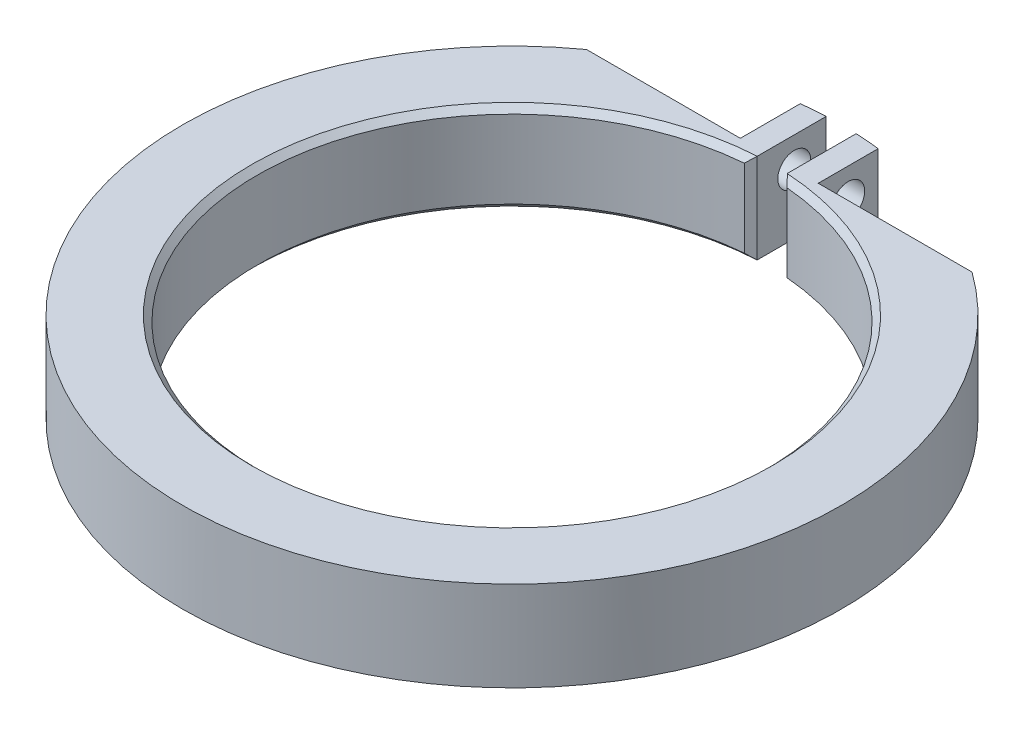
ISO-10303-21;
HEADER;
FILE_DESCRIPTION(('STEP AP214'),'2;1');
FILE_NAME('part.step','',(''),(''),'','','');
FILE_SCHEMA(('AUTOMOTIVE_DESIGN { 1 0 10303 214 1 1 1 1 }'));
ENDSEC;
DATA;
#1=APPLICATION_CONTEXT('core data for automotive mechanical design processes');
#2=APPLICATION_PROTOCOL_DEFINITION('international standard','automotive_design',2000,#1);
#3=PRODUCT_CONTEXT('',#1,'mechanical');
#4=PRODUCT('Part','Part','',(#3));
#5=PRODUCT_RELATED_PRODUCT_CATEGORY('part','',(#4));
#6=PRODUCT_DEFINITION_FORMATION('','',#4);
#7=PRODUCT_DEFINITION_CONTEXT('part definition',#1,'design');
#8=PRODUCT_DEFINITION('design','',#6,#7);
#9=PRODUCT_DEFINITION_SHAPE('','',#8);
#10=(LENGTH_UNIT() NAMED_UNIT(*) SI_UNIT(.MILLI.,.METRE.));
#11=(NAMED_UNIT(*) PLANE_ANGLE_UNIT() SI_UNIT($,.RADIAN.));
#12=(NAMED_UNIT(*) SI_UNIT($,.STERADIAN.) SOLID_ANGLE_UNIT());
#13=UNCERTAINTY_MEASURE_WITH_UNIT(LENGTH_MEASURE(1.E-05),#10,'distance_accuracy_value','');
#14=(GEOMETRIC_REPRESENTATION_CONTEXT(3) GLOBAL_UNCERTAINTY_ASSIGNED_CONTEXT((#13)) GLOBAL_UNIT_ASSIGNED_CONTEXT((#10,
#11,#12)) REPRESENTATION_CONTEXT('',''));
#15=CARTESIAN_POINT('',(0.,0.,0.));
#16=DIRECTION('',(0.,0.,1.));
#17=DIRECTION('',(1.,0.,0.));
#18=AXIS2_PLACEMENT_3D('',#15,#16,#17);
#19=CARTESIAN_POINT('',(0.,15.,0.));
#20=DIRECTION('',(0.,1.,0.));
#21=DIRECTION('',(0.,0.,1.));
#22=AXIS2_PLACEMENT_3D('',#19,#20,#21);
#23=PLANE('',#22);
#24=DIRECTION('',(0.,0.,-1.));
#25=VECTOR('',#24,1.);
#26=CARTESIAN_POINT('',(2.5,15.,-42.4264068711929));
#27=LINE('',#26,#25);
#28=CARTESIAN_POINT('',(2.5,15.,-43.4908652918344));
#29=VERTEX_POINT('',#28);
#30=CARTESIAN_POINT('',(2.50000000000001,15.,-54.9431524395898));
#31=VERTEX_POINT('',#30);
#32=EDGE_CURVE('E325',#29,#31,#27,.T.);
#33=ORIENTED_EDGE('',*,*,#32,.F.);
#34=DIRECTION('',(0.664287836400795,0.,0.747476869481558));
#35=VECTOR('',#34,1.);
#36=CARTESIAN_POINT('',(22.9917493987869,15.,-20.4329258693754));
#37=LINE('',#36,#35);
#38=CARTESIAN_POINT('',(2.55882352941177,15.,-43.4246752681621));
#39=VERTEX_POINT('',#38);
#40=EDGE_CURVE('E11',#29,#39,#37,.T.);
#41=ORIENTED_EDGE('',*,*,#40,.T.);
#42=CARTESIAN_POINT('',(0.,15.,0.));
#43=DIRECTION('',(0.,1.,0.));
#44=DIRECTION('',(0.,0.,1.));
#45=AXIS2_PLACEMENT_3D('',#42,#43,#44);
#46=CIRCLE('',#45,43.5);
#47=CARTESIAN_POINT('',(-2.5,15.,-43.4281015012169));
#48=VERTEX_POINT('',#47);
#49=EDGE_CURVE('E50',#39,#48,#46,.F.);
#50=ORIENTED_EDGE('',*,*,#49,.T.);
#51=DIRECTION('',(0.,0.,1.));
#52=VECTOR('',#51,1.);
#53=CARTESIAN_POINT('',(-2.5,15.,-42.4264068711929));
#54=LINE('',#53,#52);
#55=CARTESIAN_POINT('',(-2.5,15.,-54.9431524395898));
#56=VERTEX_POINT('',#55);
#57=EDGE_CURVE('E317',#56,#48,#54,.T.);
#58=ORIENTED_EDGE('',*,*,#57,.F.);
#59=CARTESIAN_POINT('',(0.,15.,0.));
#60=DIRECTION('',(0.,1.,0.));
#61=DIRECTION('',(0.,0.,1.));
#62=AXIS2_PLACEMENT_3D('',#59,#60,#61);
#63=CIRCLE('',#62,55.);
#64=CARTESIAN_POINT('',(-6.5,15.,-54.6145584986275));
#65=VERTEX_POINT('',#64);
#66=EDGE_CURVE('E180',#56,#65,#63,.T.);
#67=ORIENTED_EDGE('',*,*,#66,.T.);
#68=DIRECTION('',(0.,0.,-1.));
#69=VECTOR('',#68,1.);
#70=CARTESIAN_POINT('',(-6.5,15.,-54.6145584986275));
#71=LINE('',#70,#69);
#72=CARTESIAN_POINT('',(-6.5,15.,-44.6145584986275));
#73=VERTEX_POINT('',#72);
#74=EDGE_CURVE('E173',#73,#65,#71,.T.);
#75=ORIENTED_EDGE('',*,*,#74,.F.);
#76=DIRECTION('',(1.,0.,0.));
#77=VECTOR('',#76,1.);
#78=CARTESIAN_POINT('',(-6.5,15.,-44.6145584986275));
#79=LINE('',#78,#77);
#80=CARTESIAN_POINT('',(-32.1642840736826,15.,-44.6145584986274));
#81=VERTEX_POINT('',#80);
#82=EDGE_CURVE('E159',#81,#73,#79,.T.);
#83=ORIENTED_EDGE('',*,*,#82,.F.);
#84=CARTESIAN_POINT('',(32.1642840736826,15.,-44.6145584986274));
#85=VERTEX_POINT('',#84);
#86=EDGE_CURVE('E171',#81,#85,#63,.T.);
#87=ORIENTED_EDGE('',*,*,#86,.T.);
#88=DIRECTION('',(1.,0.,0.));
#89=VECTOR('',#88,1.);
#90=CARTESIAN_POINT('',(6.5,15.,-44.6145584986275));
#91=LINE('',#90,#89);
#92=CARTESIAN_POINT('',(6.5,15.,-44.6145584986275));
#93=VERTEX_POINT('',#92);
#94=EDGE_CURVE('E352',#93,#85,#91,.T.);
#95=ORIENTED_EDGE('',*,*,#94,.F.);
#96=DIRECTION('',(0.,0.,1.));
#97=VECTOR('',#96,1.);
#98=CARTESIAN_POINT('',(6.5,15.,-54.6145584986275));
#99=LINE('',#98,#97);
#100=CARTESIAN_POINT('',(6.5,15.,-54.6145584986275));
#101=VERTEX_POINT('',#100);
#102=EDGE_CURVE('E368',#101,#93,#99,.T.);
#103=ORIENTED_EDGE('',*,*,#102,.F.);
#104=EDGE_CURVE('E181',#101,#31,#63,.T.);
#105=ORIENTED_EDGE('',*,*,#104,.T.);
#106=EDGE_LOOP('',(#33,#41,#50,#58,#67,#75,#83,#87,#95,#103,#105));
#107=FACE_BOUND('',#106,.T.);
#108=ADVANCED_FACE('F35',(#107),#23,.T.);
#109=CARTESIAN_POINT('',(0.,0.,0.));
#110=DIRECTION('',(0.,1.,0.));
#111=DIRECTION('',(0.,0.,1.));
#112=AXIS2_PLACEMENT_3D('',#109,#110,#111);
#113=PLANE('',#112);
#114=DIRECTION('',(0.,0.,1.));
#115=VECTOR('',#114,1.);
#116=CARTESIAN_POINT('',(-2.5,0.,-42.4264068711929));
#117=LINE('',#116,#115);
#118=CARTESIAN_POINT('',(-2.5,0.,-54.9431524395898));
#119=VERTEX_POINT('',#118);
#120=CARTESIAN_POINT('',(-2.5,0.,-43.4281015012169));
#121=VERTEX_POINT('',#120);
#122=EDGE_CURVE('E374',#119,#121,#117,.T.);
#123=ORIENTED_EDGE('',*,*,#122,.T.);
#124=CARTESIAN_POINT('',(0.,0.,0.));
#125=DIRECTION('',(0.,1.,0.));
#126=DIRECTION('',(0.,0.,1.));
#127=AXIS2_PLACEMENT_3D('',#124,#125,#126);
#128=CIRCLE('',#127,43.5);
#129=CARTESIAN_POINT('',(2.55882352941179,0.,-43.4246752681621));
#130=VERTEX_POINT('',#129);
#131=EDGE_CURVE('E341',#121,#130,#128,.T.);
#132=ORIENTED_EDGE('',*,*,#131,.T.);
#133=DIRECTION('',(-0.664287836400795,0.,-0.747476869481558));
#134=VECTOR('',#133,1.);
#135=CARTESIAN_POINT('',(2.5,0.,-43.4908652918344));
#136=LINE('',#135,#134);
#137=CARTESIAN_POINT('',(2.5,0.,-43.4908652918344));
#138=VERTEX_POINT('',#137);
#139=EDGE_CURVE('E343',#130,#138,#136,.T.);
#140=ORIENTED_EDGE('',*,*,#139,.T.);
#141=DIRECTION('',(0.,0.,-1.));
#142=VECTOR('',#141,1.);
#143=CARTESIAN_POINT('',(2.5,0.,-42.4264068711929));
#144=LINE('',#143,#142);
#145=CARTESIAN_POINT('',(2.50000000000001,0.,-54.9431524395898));
#146=VERTEX_POINT('',#145);
#147=EDGE_CURVE('E324',#138,#146,#144,.T.);
#148=ORIENTED_EDGE('',*,*,#147,.T.);
#149=CARTESIAN_POINT('',(0.,0.,0.));
#150=DIRECTION('',(0.,1.,0.));
#151=DIRECTION('',(0.,0.,1.));
#152=AXIS2_PLACEMENT_3D('',#149,#150,#151);
#153=CIRCLE('',#152,55.);
#154=EDGE_CURVE('E185',#119,#146,#153,.T.);
#155=ORIENTED_EDGE('',*,*,#154,.F.);
#156=EDGE_LOOP('',(#123,#132,#140,#148,#155));
#157=FACE_BOUND('',#156,.T.);
#158=ADVANCED_FACE('F276',(#157),#113,.F.);
#159=CARTESIAN_POINT('',(0.,15.,0.));
#160=DIRECTION('',(0.,-1.,0.));
#161=DIRECTION('',(0.,0.,-1.));
#162=AXIS2_PLACEMENT_3D('',#159,#160,#161);
#163=CYLINDRICAL_SURFACE('',#162,55.);
#164=CARTESIAN_POINT('',(0.,5.,0.));
#165=DIRECTION('',(0.,1.,0.));
#166=DIRECTION('',(0.,0.,1.));
#167=AXIS2_PLACEMENT_3D('',#164,#165,#166);
#168=CIRCLE('',#167,55.);
#169=CARTESIAN_POINT('',(-6.5,5.,-54.6145584986275));
#170=VERTEX_POINT('',#169);
#171=CARTESIAN_POINT('',(-29.1904596739764,5.,-46.6145584986274));
#172=VERTEX_POINT('',#171);
#173=EDGE_CURVE('E400',#170,#172,#168,.T.);
#174=ORIENTED_EDGE('',*,*,#173,.F.);
#175=DIRECTION('',(0.,1.,0.));
#176=VECTOR('',#175,1.);
#177=CARTESIAN_POINT('',(-6.5,5.,-54.6145584986275));
#178=LINE('',#177,#176);
#179=EDGE_CURVE('E377',#170,#65,#178,.T.);
#180=ORIENTED_EDGE('',*,*,#179,.T.);
#181=ORIENTED_EDGE('',*,*,#66,.F.);
#182=DIRECTION('',(0.,1.,0.));
#183=VECTOR('',#182,1.);
#184=CARTESIAN_POINT('',(-2.5,0.,-54.9431524395898));
#185=LINE('',#184,#183);
#186=EDGE_CURVE('E192',#119,#56,#185,.T.);
#187=ORIENTED_EDGE('',*,*,#186,.F.);
#188=ORIENTED_EDGE('',*,*,#154,.T.);
#189=DIRECTION('',(0.,1.,0.));
#190=VECTOR('',#189,1.);
#191=CARTESIAN_POINT('',(2.50000000000001,0.,-54.9431524395898));
#192=LINE('',#191,#190);
#193=EDGE_CURVE('E188',#146,#31,#192,.T.);
#194=ORIENTED_EDGE('',*,*,#193,.T.);
#195=ORIENTED_EDGE('',*,*,#104,.F.);
#196=DIRECTION('',(0.,1.,0.));
#197=VECTOR('',#196,1.);
#198=CARTESIAN_POINT('',(6.5,5.,-54.6145584986275));
#199=LINE('',#198,#197);
#200=CARTESIAN_POINT('',(6.5,5.,-54.6145584986275));
#201=VERTEX_POINT('',#200);
#202=EDGE_CURVE('E363',#201,#101,#199,.T.);
#203=ORIENTED_EDGE('',*,*,#202,.F.);
#204=CARTESIAN_POINT('',(0.,5.,0.));
#205=DIRECTION('',(0.,1.,0.));
#206=DIRECTION('',(0.,0.,-1.));
#207=AXIS2_PLACEMENT_3D('',#204,#205,#206);
#208=CIRCLE('',#207,55.);
#209=CARTESIAN_POINT('',(29.1904596739764,5.,-46.6145584986274));
#210=VERTEX_POINT('',#209);
#211=EDGE_CURVE('E347',#210,#201,#208,.T.);
#212=ORIENTED_EDGE('',*,*,#211,.F.);
#213=CARTESIAN_POINT('',(29.1904596739764,5.,-46.6145584986274));
#214=CARTESIAN_POINT('',(29.2618950582999,5.00000410830266,-46.5698251893079));
#215=CARTESIAN_POINT('',(29.3332214542748,5.00150048570252,-46.5249310861389));
#216=CARTESIAN_POINT('',(29.4755868914035,5.0075763970651,-46.4348670040117));
#217=CARTESIAN_POINT('',(29.5466258737238,5.01215653303706,-46.3896969728934));
#218=CARTESIAN_POINT('',(29.7597310130058,5.03071895077998,-46.2535066736511));
#219=CARTESIAN_POINT('',(29.9012139733787,5.04952488058544,-46.1621640296161));
#220=CARTESIAN_POINT('',(30.182670971722,5.10137602829001,-45.9786345991746));
#221=CARTESIAN_POINT('',(30.3226236335103,5.13453487780392,-45.8864469467475));
#222=CARTESIAN_POINT('',(30.5982104292876,5.21691294581438,-45.7031374911376));
#223=CARTESIAN_POINT('',(30.7338526875045,5.26609970842943,-45.6120139163039));
#224=CARTESIAN_POINT('',(30.9136296618075,5.34558281005282,-45.4901176550028));
#225=CARTESIAN_POINT('',(30.9606118537982,5.36773726369652,-45.4581531074483));
#226=CARTESIAN_POINT('',(31.0535962187872,5.41460931547153,-45.3946839265736));
#227=CARTESIAN_POINT('',(31.0995984037196,5.43932688236891,-45.3631792876545));
#228=CARTESIAN_POINT('',(31.2358324010681,5.51755206138873,-45.2695800291169));
#229=CARTESIAN_POINT('',(31.3243712222158,5.57516652162368,-45.2083460759812));
#230=CARTESIAN_POINT('',(31.4956258256684,5.70344966090385,-45.0892063366155));
#231=CARTESIAN_POINT('',(31.5782840147289,5.77422792917874,-45.0313342782552));
#232=CARTESIAN_POINT('',(31.7336467298936,5.93031105628469,-44.9219837573017));
#233=CARTESIAN_POINT('',(31.8063702734681,6.01558743878918,-44.8704930971201));
#234=CARTESIAN_POINT('',(31.9143565542687,6.16983570890459,-44.7937120687995));
#235=CARTESIAN_POINT('',(31.9539029113345,6.23433491007644,-44.765499859494));
#236=CARTESIAN_POINT('',(32.0245392338627,6.37001782794382,-44.7149948904175));
#237=CARTESIAN_POINT('',(32.0556364037224,6.44119577972369,-44.6926970879768));
#238=CARTESIAN_POINT('',(32.1035804569386,6.5789853609633,-44.6582677032646));
#239=CARTESIAN_POINT('',(32.1218028956664,6.64486834930053,-44.6451569510118));
#240=CARTESIAN_POINT('',(32.1489536197877,6.7794006321575,-44.6256101405288));
#241=CARTESIAN_POINT('',(32.1579050349218,6.84804259636878,-44.6191574715829));
#242=CARTESIAN_POINT('',(32.163494337862,6.94466530757117,-44.6151276772019));
#243=CARTESIAN_POINT('',(32.1642975804329,6.97233836171307,-44.6145483681533));
#244=CARTESIAN_POINT('',(32.1642840736826,7.,-44.6145584986274));
#245=B_SPLINE_CURVE_WITH_KNOTS('',3,(#213,#214,#215,#216,#217,#218,#219,#220,#221,#222,#223,
#224,#225,#226,#227,#228,#229,#230,#231,#232,#233,#234,#235,#236,#237,#238,#239,#240,#241,#242,
#243,#244),.UNSPECIFIED.,.F.,.F.,(4,2,2,2,2,2,2,2,2,2,2,2,2,2,2,4),(0.,0.25282771647522,
0.505704804121882,1.01347651754073,1.52534395540327,2.03618125719,2.21910112323622,
2.40201876049517,2.76754890573759,3.13627064080194,3.5042763492189,3.74577355016985,
3.98706418200524,4.19500426291173,4.40242430726866,4.48542557306862),.UNSPECIFIED.);
#246=CARTESIAN_POINT('',(32.1642840736826,7.,-44.6145584986274));
#247=VERTEX_POINT('',#246);
#248=EDGE_CURVE('E213',#210,#247,#245,.T.);
#249=ORIENTED_EDGE('',*,*,#248,.T.);
#250=DIRECTION('',(0.,1.,0.));
#251=VECTOR('',#250,1.);
#252=CARTESIAN_POINT('',(32.1642840736826,5.,-44.6145584986274));
#253=LINE('',#252,#251);
#254=EDGE_CURVE('E174',#247,#85,#253,.T.);
#255=ORIENTED_EDGE('',*,*,#254,.T.);
#256=ORIENTED_EDGE('',*,*,#86,.F.);
#257=DIRECTION('',(0.,1.,0.));
#258=VECTOR('',#257,1.);
#259=CARTESIAN_POINT('',(-32.1642840736826,5.,-44.6145584986274));
#260=LINE('',#259,#258);
#261=CARTESIAN_POINT('',(-32.1642840736826,7.,-44.6145584986274));
#262=VERTEX_POINT('',#261);
#263=EDGE_CURVE('E155',#262,#81,#260,.T.);
#264=ORIENTED_EDGE('',*,*,#263,.F.);
#265=CARTESIAN_POINT('',(-32.1642840736826,7.,-44.6145584986274));
#266=CARTESIAN_POINT('',(-32.1643007930241,6.95962654996886,-44.6145458588829));
#267=CARTESIAN_POINT('',(-32.1625889999668,6.91926554770767,-44.6157805302863));
#268=CARTESIAN_POINT('',(-32.1558383664156,6.83901869520496,-44.6206464551745));
#269=CARTESIAN_POINT('',(-32.1508037826462,6.79913230342107,-44.6242746423976));
#270=CARTESIAN_POINT('',(-32.1376164344037,6.7206527281823,-44.6337727601258));
#271=CARTESIAN_POINT('',(-32.1295017608624,6.68204977529407,-44.6396153047959));
#272=CARTESIAN_POINT('',(-32.1103702607454,6.6059539996012,-44.6533790601372));
#273=CARTESIAN_POINT('',(-32.0993527118299,6.56846145569297,-44.6613007881821));
#274=CARTESIAN_POINT('',(-32.0624414049865,6.45841174838379,-44.6878144789277));
#275=CARTESIAN_POINT('',(-32.0326055683359,6.38781396457675,-44.7092152345839));
#276=CARTESIAN_POINT('',(-31.9644894091069,6.25290586522998,-44.7579398251131));
#277=CARTESIAN_POINT('',(-31.9261815324406,6.18861707713267,-44.7852829816436));
#278=CARTESIAN_POINT('',(-31.8203085100542,6.0332174427758,-44.8606078665391));
#279=CARTESIAN_POINT('',(-31.7482128027911,5.94670884784141,-44.9116894360233));
#280=CARTESIAN_POINT('',(-31.5937875931604,5.78834388503713,-45.0204571304663));
#281=CARTESIAN_POINT('',(-31.5114378583423,5.71651724795518,-45.0781562944737));
#282=CARTESIAN_POINT('',(-31.3547501014121,5.59710350456871,-45.187245316554));
#283=CARTESIAN_POINT('',(-31.2814946507567,5.54747277963951,-45.2379971710635));
#284=CARTESIAN_POINT('',(-31.1314531874134,5.45604765513646,-45.3413820614901));
#285=CARTESIAN_POINT('',(-31.0546648215676,5.4142585755384,-45.3940163458795));
#286=CARTESIAN_POINT('',(-30.8981822449858,5.33759542300357,-45.5006740409138));
#287=CARTESIAN_POINT('',(-30.8184782061336,5.30274790323949,-45.5547019253211));
#288=CARTESIAN_POINT('',(-30.6570430183275,5.23947550200878,-45.6634996036769));
#289=CARTESIAN_POINT('',(-30.5753113309136,5.21105234729605,-45.7182695929068));
#290=CARTESIAN_POINT('',(-30.3868374511277,5.15283220921085,-45.843825213226));
#291=CARTESIAN_POINT('',(-30.2795908446476,5.12494198124811,-45.9147372344463));
#292=CARTESIAN_POINT('',(-30.0632331561396,5.07792506055661,-46.0566908920685));
#293=CARTESIAN_POINT('',(-29.9541211799253,5.05880270035894,-46.1277325751718));
#294=CARTESIAN_POINT('',(-29.7362916235818,5.0288806120298,-46.2684503752386));
#295=CARTESIAN_POINT('',(-29.6275933720868,5.01795849583825,-46.3381308042381));
#296=CARTESIAN_POINT('',(-29.4094898289416,5.00353665055713,-46.4768615567524));
#297=CARTESIAN_POINT('',(-29.3000855751165,5.00002778026472,-46.5459125516248));
#298=CARTESIAN_POINT('',(-29.1904596739764,5.,-46.6145584986274));
#299=B_SPLINE_CURVE_WITH_KNOTS('',3,(#265,#266,#267,#268,#269,#270,#271,#272,#273,#274,#275,
#276,#277,#278,#279,#280,#281,#282,#283,#284,#285,#286,#287,#288,#289,#290,#291,#292,#293,#294,
#295,#296,#297,#298),.UNSPECIFIED.,.F.,.F.,(4,2,2,2,2,2,2,2,2,2,2,2,2,2,2,2,4),(0.,
0.12104516813012,0.241935569244906,0.361377234494594,0.480848649244449,0.718373440455049,
0.956682414734294,1.32555498811106,1.6951672814864,2.00076537448538,2.30657004946758,
2.61352294044258,2.92055823698864,3.31488348287743,3.70940337016977,4.09791115867101,
4.48593960164287),.UNSPECIFIED.);
#300=EDGE_CURVE('E205',#262,#172,#299,.T.);
#301=ORIENTED_EDGE('',*,*,#300,.T.);
#302=EDGE_LOOP('',(#174,#180,#181,#187,#188,#194,#195,#203,#212,#249,#255,#256,#264,#301));
#303=FACE_BOUND('',#302,.T.);
#304=ADVANCED_FACE('F177',(#303),#163,.T.);
#305=CARTESIAN_POINT('',(0.,15.,0.));
#306=DIRECTION('',(0.,-1.,0.));
#307=DIRECTION('',(0.,0.,-1.));
#308=AXIS2_PLACEMENT_3D('',#305,#306,#307);
#309=CYLINDRICAL_SURFACE('',#308,42.5);
#310=DIRECTION('',(0.,-1.,0.));
#311=VECTOR('',#310,1.);
#312=CARTESIAN_POINT('',(3.50959029773664,15.,-42.3548435948244));
#313=LINE('',#312,#311);
#314=CARTESIAN_POINT('',(3.50959029773664,14.,-42.3548435948244));
#315=VERTEX_POINT('',#314);
#316=CARTESIAN_POINT('',(3.50959029773664,0.999999999999994,-42.3548435948244));
#317=VERTEX_POINT('',#316);
#318=EDGE_CURVE('E333',#315,#317,#313,.T.);
#319=ORIENTED_EDGE('',*,*,#318,.T.);
#320=CARTESIAN_POINT('',(0.,0.999999999999994,0.));
#321=DIRECTION('',(0.,1.,0.));
#322=DIRECTION('',(0.,0.,1.));
#323=AXIS2_PLACEMENT_3D('',#320,#321,#322);
#324=CIRCLE('',#323,42.5);
#325=CARTESIAN_POINT('',(-3.57722169683968,0.999999999999994,-42.3491851743532));
#326=VERTEX_POINT('',#325);
#327=EDGE_CURVE('E330',#317,#326,#324,.F.);
#328=ORIENTED_EDGE('',*,*,#327,.T.);
#329=DIRECTION('',(0.,-1.,0.));
#330=VECTOR('',#329,1.);
#331=CARTESIAN_POINT('',(-3.57722169683968,15.,-42.3491851743532));
#332=LINE('',#331,#330);
#333=CARTESIAN_POINT('',(-3.57722169683968,14.,-42.3491851743532));
#334=VERTEX_POINT('',#333);
#335=EDGE_CURVE('E339',#326,#334,#332,.F.);
#336=ORIENTED_EDGE('',*,*,#335,.T.);
#337=CARTESIAN_POINT('',(0.,14.,0.));
#338=DIRECTION('',(0.,1.,0.));
#339=DIRECTION('',(0.,0.,1.));
#340=AXIS2_PLACEMENT_3D('',#337,#338,#339);
#341=CIRCLE('',#340,42.5);
#342=EDGE_CURVE('E337',#334,#315,#341,.T.);
#343=ORIENTED_EDGE('',*,*,#342,.T.);
#344=EDGE_LOOP('',(#319,#328,#336,#343));
#345=FACE_BOUND('',#344,.T.);
#346=ADVANCED_FACE('F283',(#345),#309,.F.);
#347=CARTESIAN_POINT('',(2.5,0.,-42.4264068711929));
#348=DIRECTION('',(1.,0.,0.));
#349=DIRECTION('',(0.,0.,-1.));
#350=AXIS2_PLACEMENT_3D('',#347,#348,#349);
#351=PLANE('',#350);
#352=CARTESIAN_POINT('',(2.5,10.,-49.6145584986275));
#353=DIRECTION('',(1.,0.,0.));
#354=DIRECTION('',(0.,0.,-1.));
#355=AXIS2_PLACEMENT_3D('',#352,#353,#354);
#356=CIRCLE('',#355,2.75);
#357=CARTESIAN_POINT('',(2.5,10.,-52.3645584986275));
#358=VERTEX_POINT('',#357);
#359=EDGE_CURVE('E370',#358,#358,#356,.T.);
#360=ORIENTED_EDGE('',*,*,#359,.T.);
#361=EDGE_LOOP('',(#360));
#362=FACE_BOUND('',#361,.T.);
#363=ORIENTED_EDGE('',*,*,#147,.F.);
#364=DIRECTION('',(0.,1.,0.));
#365=VECTOR('',#364,1.);
#366=CARTESIAN_POINT('',(2.5,15.,-43.4908652918344));
#367=LINE('',#366,#365);
#368=EDGE_CURVE('E64',#138,#29,#367,.T.);
#369=ORIENTED_EDGE('',*,*,#368,.T.);
#370=ORIENTED_EDGE('',*,*,#32,.T.);
#371=ORIENTED_EDGE('',*,*,#193,.F.);
#372=EDGE_LOOP('',(#363,#369,#370,#371));
#373=FACE_BOUND('',#372,.T.);
#374=ADVANCED_FACE('F286',(#362,#373),#351,.F.);
#375=CARTESIAN_POINT('',(-2.5,0.,-42.4264068711929));
#376=DIRECTION('',(-1.,0.,0.));
#377=DIRECTION('',(0.,0.,1.));
#378=AXIS2_PLACEMENT_3D('',#375,#376,#377);
#379=PLANE('',#378);
#380=CARTESIAN_POINT('',(-2.5,10.,-49.6145584986274));
#381=DIRECTION('',(-1.,0.,0.));
#382=DIRECTION('',(0.,0.,1.));
#383=AXIS2_PLACEMENT_3D('',#380,#381,#382);
#384=CIRCLE('',#383,2.75);
#385=CARTESIAN_POINT('',(-2.5,10.,-46.8645584986274));
#386=VERTEX_POINT('',#385);
#387=EDGE_CURVE('E393',#386,#386,#384,.T.);
#388=ORIENTED_EDGE('',*,*,#387,.T.);
#389=EDGE_LOOP('',(#388));
#390=FACE_BOUND('',#389,.T.);
#391=DIRECTION('',(0.,-1.,0.));
#392=VECTOR('',#391,1.);
#393=CARTESIAN_POINT('',(-2.5,0.,-43.4264068711929));
#394=LINE('',#393,#392);
#395=CARTESIAN_POINT('',(-2.5,14.9983081710357,-43.4264068711929));
#396=VERTEX_POINT('',#395);
#397=CARTESIAN_POINT('',(-2.5,0.00169182896429119,-43.4264068711929));
#398=VERTEX_POINT('',#397);
#399=EDGE_CURVE('E329',#396,#398,#394,.T.);
#400=ORIENTED_EDGE('',*,*,#399,.T.);
#401=CARTESIAN_POINT('',(-2.5,0.00169182896429119,-43.4264068711929));
#402=CARTESIAN_POINT('',(-2.5,0.00140985747024297,-43.4266893095302));
#403=CARTESIAN_POINT('',(-2.5,0.00112788597619418,-43.4269717478676));
#404=CARTESIAN_POINT('',(-2.5,0.000563942988096584,-43.4275366245422));
#405=CARTESIAN_POINT('',(-2.5,0.000281971494047789,-43.4278190628796));
#406=CARTESIAN_POINT('',(-2.5,0.,-43.4281015012169));
#407=B_SPLINE_CURVE_WITH_KNOTS('',3,(#401,#402,#403,#404,#405,#406),.UNSPECIFIED.,.F.,.F.,(4,2,
4),(0.,0.00119729446698745,0.00239458893396999),.UNSPECIFIED.);
#408=EDGE_CURVE('E308',#398,#121,#407,.T.);
#409=ORIENTED_EDGE('',*,*,#408,.T.);
#410=ORIENTED_EDGE('',*,*,#122,.F.);
#411=ORIENTED_EDGE('',*,*,#186,.T.);
#412=ORIENTED_EDGE('',*,*,#57,.T.);
#413=CARTESIAN_POINT('',(-2.5,15.,-43.4281015012169));
#414=CARTESIAN_POINT('',(-2.5,14.9997180285059,-43.4278190628796));
#415=CARTESIAN_POINT('',(-2.5,14.9994360570119,-43.4275366245422));
#416=CARTESIAN_POINT('',(-2.5,14.9988721140238,-43.4269717478676));
#417=CARTESIAN_POINT('',(-2.5,14.9985901425297,-43.4266893095302));
#418=CARTESIAN_POINT('',(-2.5,14.9983081710357,-43.4264068711929));
#419=B_SPLINE_CURVE_WITH_KNOTS('',3,(#413,#414,#415,#416,#417,#418),.UNSPECIFIED.,.F.,.F.,(4,2,
4),(0.,0.00119729446699669,0.00239458893398847),.UNSPECIFIED.);
#420=EDGE_CURVE('E301',#48,#396,#419,.T.);
#421=ORIENTED_EDGE('',*,*,#420,.T.);
#422=EDGE_LOOP('',(#400,#409,#410,#411,#412,#421));
#423=FACE_BOUND('',#422,.T.);
#424=ADVANCED_FACE('F290',(#390,#423),#379,.F.);
#425=CARTESIAN_POINT('',(6.5,5.,-44.6145584986275));
#426=DIRECTION('',(0.,0.,1.));
#427=DIRECTION('',(1.,0.,0.));
#428=AXIS2_PLACEMENT_3D('',#425,#426,#427);
#429=PLANE('',#428);
#430=ORIENTED_EDGE('',*,*,#254,.F.);
#431=DIRECTION('',(1.,0.,0.));
#432=VECTOR('',#431,1.);
#433=CARTESIAN_POINT('',(6.5,7.,-44.6145584986275));
#434=LINE('',#433,#432);
#435=CARTESIAN_POINT('',(6.5,7.,-44.6145584986275));
#436=VERTEX_POINT('',#435);
#437=EDGE_CURVE('E201',#247,#436,#434,.F.);
#438=ORIENTED_EDGE('',*,*,#437,.T.);
#439=DIRECTION('',(0.,1.,0.));
#440=VECTOR('',#439,1.);
#441=CARTESIAN_POINT('',(6.5,5.,-44.6145584986275));
#442=LINE('',#441,#440);
#443=EDGE_CURVE('E353',#436,#93,#442,.T.);
#444=ORIENTED_EDGE('',*,*,#443,.T.);
#445=ORIENTED_EDGE('',*,*,#94,.T.);
#446=EDGE_LOOP('',(#430,#438,#444,#445));
#447=FACE_BOUND('',#446,.T.);
#448=ADVANCED_FACE('F295',(#447),#429,.F.);
#449=CARTESIAN_POINT('',(6.5,5.,-54.6145584986275));
#450=DIRECTION('',(-1.,0.,0.));
#451=DIRECTION('',(0.,0.,1.));
#452=AXIS2_PLACEMENT_3D('',#449,#450,#451);
#453=PLANE('',#452);
#454=CARTESIAN_POINT('',(6.5,10.,-49.6145584986275));
#455=DIRECTION('',(-1.,0.,0.));
#456=DIRECTION('',(0.,0.,1.));
#457=AXIS2_PLACEMENT_3D('',#454,#455,#456);
#458=CIRCLE('',#457,2.75);
#459=CARTESIAN_POINT('',(6.5,10.,-46.8645584986275));
#460=VERTEX_POINT('',#459);
#461=EDGE_CURVE('E388',#460,#460,#458,.T.);
#462=ORIENTED_EDGE('',*,*,#461,.T.);
#463=EDGE_LOOP('',(#462));
#464=FACE_BOUND('',#463,.T.);
#465=ORIENTED_EDGE('',*,*,#443,.F.);
#466=CARTESIAN_POINT('',(6.5,7.,-46.6145584986275));
#467=DIRECTION('',(-1.,0.,0.));
#468=DIRECTION('',(0.,0.,1.));
#469=AXIS2_PLACEMENT_3D('',#466,#467,#468);
#470=CIRCLE('',#469,2.);
#471=CARTESIAN_POINT('',(6.5,5.,-46.6145584986275));
#472=VERTEX_POINT('',#471);
#473=EDGE_CURVE('E203',#436,#472,#470,.F.);
#474=ORIENTED_EDGE('',*,*,#473,.T.);
#475=DIRECTION('',(0.,0.,1.));
#476=VECTOR('',#475,1.);
#477=CARTESIAN_POINT('',(6.5,5.,-54.6145584986275));
#478=LINE('',#477,#476);
#479=EDGE_CURVE('E359',#201,#472,#478,.T.);
#480=ORIENTED_EDGE('',*,*,#479,.F.);
#481=ORIENTED_EDGE('',*,*,#202,.T.);
#482=ORIENTED_EDGE('',*,*,#102,.T.);
#483=EDGE_LOOP('',(#465,#474,#480,#481,#482));
#484=FACE_BOUND('',#483,.T.);
#485=ADVANCED_FACE('F297',(#464,#484),#453,.F.);
#486=CARTESIAN_POINT('',(0.,5.,0.));
#487=DIRECTION('',(0.,-1.,0.));
#488=DIRECTION('',(0.,0.,-1.));
#489=AXIS2_PLACEMENT_3D('',#486,#487,#488);
#490=PLANE('',#489);
#491=ORIENTED_EDGE('',*,*,#479,.T.);
#492=DIRECTION('',(1.,0.,0.));
#493=VECTOR('',#492,1.);
#494=CARTESIAN_POINT('',(32.1642840736826,5.,-46.6145584986274));
#495=LINE('',#494,#493);
#496=EDGE_CURVE('E198',#472,#210,#495,.T.);
#497=ORIENTED_EDGE('',*,*,#496,.T.);
#498=ORIENTED_EDGE('',*,*,#211,.T.);
#499=EDGE_LOOP('',(#491,#497,#498));
#500=FACE_BOUND('',#499,.T.);
#501=ADVANCED_FACE('F362',(#500),#490,.F.);
#502=CARTESIAN_POINT('',(-6.5,5.,-54.6145584986275));
#503=DIRECTION('',(1.,0.,0.));
#504=DIRECTION('',(0.,0.,-1.));
#505=AXIS2_PLACEMENT_3D('',#502,#503,#504);
#506=PLANE('',#505);
#507=CARTESIAN_POINT('',(-6.50000000000002,10.,-49.6145584986274));
#508=DIRECTION('',(-1.,0.,0.));
#509=DIRECTION('',(0.,0.,1.));
#510=AXIS2_PLACEMENT_3D('',#507,#508,#509);
#511=CIRCLE('',#510,2.75);
#512=CARTESIAN_POINT('',(-6.50000000000002,10.,-46.8645584986274));
#513=VERTEX_POINT('',#512);
#514=EDGE_CURVE('E386',#513,#513,#511,.T.);
#515=ORIENTED_EDGE('',*,*,#514,.F.);
#516=EDGE_LOOP('',(#515));
#517=FACE_BOUND('',#516,.T.);
#518=DIRECTION('',(0.,0.,-1.));
#519=VECTOR('',#518,1.);
#520=CARTESIAN_POINT('',(-6.5,5.,-54.6145584986275));
#521=LINE('',#520,#519);
#522=CARTESIAN_POINT('',(-6.5,5.,-46.6145584986275));
#523=VERTEX_POINT('',#522);
#524=EDGE_CURVE('E167',#523,#170,#521,.T.);
#525=ORIENTED_EDGE('',*,*,#524,.F.);
#526=CARTESIAN_POINT('',(-6.5,7.,-46.6145584986275));
#527=DIRECTION('',(1.,0.,0.));
#528=DIRECTION('',(0.,0.,-1.));
#529=AXIS2_PLACEMENT_3D('',#526,#527,#528);
#530=CIRCLE('',#529,2.);
#531=CARTESIAN_POINT('',(-6.5,7.,-44.6145584986275));
#532=VERTEX_POINT('',#531);
#533=EDGE_CURVE('E195',#523,#532,#530,.F.);
#534=ORIENTED_EDGE('',*,*,#533,.T.);
#535=DIRECTION('',(0.,1.,0.));
#536=VECTOR('',#535,1.);
#537=CARTESIAN_POINT('',(-6.5,5.,-44.6145584986275));
#538=LINE('',#537,#536);
#539=EDGE_CURVE('E166',#532,#73,#538,.T.);
#540=ORIENTED_EDGE('',*,*,#539,.T.);
#541=ORIENTED_EDGE('',*,*,#74,.T.);
#542=ORIENTED_EDGE('',*,*,#179,.F.);
#543=EDGE_LOOP('',(#525,#534,#540,#541,#542));
#544=FACE_BOUND('',#543,.T.);
#545=ADVANCED_FACE('F409',(#517,#544),#506,.F.);
#546=CARTESIAN_POINT('',(-6.5,5.,-44.6145584986275));
#547=DIRECTION('',(0.,0.,1.));
#548=DIRECTION('',(1.,0.,0.));
#549=AXIS2_PLACEMENT_3D('',#546,#547,#548);
#550=PLANE('',#549);
#551=ORIENTED_EDGE('',*,*,#539,.F.);
#552=DIRECTION('',(1.,0.,0.));
#553=VECTOR('',#552,1.);
#554=CARTESIAN_POINT('',(-6.5,7.,-44.6145584986275));
#555=LINE('',#554,#553);
#556=EDGE_CURVE('E162',#532,#262,#555,.F.);
#557=ORIENTED_EDGE('',*,*,#556,.T.);
#558=ORIENTED_EDGE('',*,*,#263,.T.);
#559=ORIENTED_EDGE('',*,*,#82,.T.);
#560=EDGE_LOOP('',(#551,#557,#558,#559));
#561=FACE_BOUND('',#560,.T.);
#562=ADVANCED_FACE('F158',(#561),#550,.F.);
#563=CARTESIAN_POINT('',(0.,5.,0.));
#564=DIRECTION('',(0.,1.,0.));
#565=DIRECTION('',(0.,0.,1.));
#566=AXIS2_PLACEMENT_3D('',#563,#564,#565);
#567=PLANE('',#566);
#568=ORIENTED_EDGE('',*,*,#173,.T.);
#569=DIRECTION('',(1.,0.,0.));
#570=VECTOR('',#569,1.);
#571=CARTESIAN_POINT('',(0.,5.,-46.6145584986275));
#572=LINE('',#571,#570);
#573=EDGE_CURVE('E183',#172,#523,#572,.T.);
#574=ORIENTED_EDGE('',*,*,#573,.T.);
#575=ORIENTED_EDGE('',*,*,#524,.T.);
#576=EDGE_LOOP('',(#568,#574,#575));
#577=FACE_BOUND('',#576,.T.);
#578=ADVANCED_FACE('F413',(#577),#567,.T.);
#579=CARTESIAN_POINT('',(55.,10.,-49.6145584986275));
#580=DIRECTION('',(-1.,0.,0.));
#581=DIRECTION('',(0.,0.,1.));
#582=AXIS2_PLACEMENT_3D('',#579,#580,#581);
#583=CYLINDRICAL_SURFACE('',#582,2.75);
#584=ORIENTED_EDGE('',*,*,#514,.T.);
#585=EDGE_LOOP('',(#584));
#586=FACE_BOUND('',#585,.T.);
#587=ORIENTED_EDGE('',*,*,#387,.F.);
#588=EDGE_LOOP('',(#587));
#589=FACE_BOUND('',#588,.T.);
#590=ADVANCED_FACE('F490',(#586,#589),#583,.F.);
#591=ORIENTED_EDGE('',*,*,#461,.F.);
#592=EDGE_LOOP('',(#591));
#593=FACE_BOUND('',#592,.T.);
#594=ORIENTED_EDGE('',*,*,#359,.F.);
#595=EDGE_LOOP('',(#594));
#596=FACE_BOUND('',#595,.T.);
#597=ADVANCED_FACE('F226',(#593,#596),#583,.F.);
#598=CARTESIAN_POINT('',(0.,7.,-46.6145584986275));
#599=DIRECTION('',(1.,0.,0.));
#600=DIRECTION('',(0.,0.,-1.));
#601=AXIS2_PLACEMENT_3D('',#598,#599,#600);
#602=CYLINDRICAL_SURFACE('',#601,2.);
#603=ORIENTED_EDGE('',*,*,#300,.F.);
#604=ORIENTED_EDGE('',*,*,#556,.F.);
#605=ORIENTED_EDGE('',*,*,#533,.F.);
#606=ORIENTED_EDGE('',*,*,#573,.F.);
#607=EDGE_LOOP('',(#603,#604,#605,#606));
#608=FACE_BOUND('',#607,.T.);
#609=ADVANCED_FACE('F222',(#608),#602,.F.);
#610=CARTESIAN_POINT('',(0.,7.,-46.6145584986275));
#611=DIRECTION('',(-1.,0.,0.));
#612=DIRECTION('',(0.,0.,1.));
#613=AXIS2_PLACEMENT_3D('',#610,#611,#612);
#614=CYLINDRICAL_SURFACE('',#613,2.);
#615=ORIENTED_EDGE('',*,*,#473,.F.);
#616=ORIENTED_EDGE('',*,*,#437,.F.);
#617=ORIENTED_EDGE('',*,*,#248,.F.);
#618=ORIENTED_EDGE('',*,*,#496,.F.);
#619=EDGE_LOOP('',(#615,#616,#617,#618));
#620=FACE_BOUND('',#619,.T.);
#621=ADVANCED_FACE('F225',(#620),#614,.F.);
#622=CARTESIAN_POINT('',(0.,14.,0.));
#623=DIRECTION('',(0.,1.,0.));
#624=DIRECTION('',(0.,0.,1.));
#625=AXIS2_PLACEMENT_3D('',#622,#623,#624);
#626=CONICAL_SURFACE('',#625,42.5,0.785398163397445);
#627=CARTESIAN_POINT('',(2.55882352941177,15.,-43.4246752681621));
#628=CARTESIAN_POINT('',(2.71665090503061,14.831967915279,-43.2470831067803));
#629=CARTESIAN_POINT('',(2.87479514928997,14.6646185474579,-43.0691343951706));
#630=CARTESIAN_POINT('',(3.19171740527753,14.3312852138644,-42.7125238375272));
#631=CARTESIAN_POINT('',(3.35049541712646,14.1653012483522,-42.5338619913576));
#632=CARTESIAN_POINT('',(3.50959029773664,14.,-42.3548435948244));
#633=B_SPLINE_CURVE_WITH_KNOTS('',3,(#627,#628,#629,#630,#631,#632),.UNSPECIFIED.,.F.,.F.,(4,2,
4),(0.,0.873000808587466,1.74600178348678),.UNSPECIFIED.);
#634=EDGE_CURVE('E252',#315,#39,#633,.F.);
#635=ORIENTED_EDGE('',*,*,#634,.F.);
#636=ORIENTED_EDGE('',*,*,#342,.F.);
#637=CARTESIAN_POINT('',(-2.5,14.9983081710357,-43.4264068711929));
#638=CARTESIAN_POINT('',(-2.67870499980783,14.830128130223,-43.2477018713851));
#639=CARTESIAN_POINT('',(-2.85782596136104,14.6628457741727,-43.0685809098319));
#640=CARTESIAN_POINT('',(-3.21689986006615,14.3300763833064,-42.7095070111268));
#641=CARTESIAN_POINT('',(-3.39685279745949,14.1645893490114,-42.5295540737334));
#642=CARTESIAN_POINT('',(-3.57722169683968,14.,-42.3491851743532));
#643=B_SPLINE_CURVE_WITH_KNOTS('',3,(#637,#638,#639,#640,#641,#642),.UNSPECIFIED.,.F.,.F.,(4,2,
4),(0.,0.910696557274153,1.8213933788644),.UNSPECIFIED.);
#644=EDGE_CURVE('E41',#396,#334,#643,.T.);
#645=ORIENTED_EDGE('',*,*,#644,.F.);
#646=ORIENTED_EDGE('',*,*,#420,.F.);
#647=ORIENTED_EDGE('',*,*,#49,.F.);
#648=EDGE_LOOP('',(#635,#636,#645,#646,#647));
#649=FACE_BOUND('',#648,.T.);
#650=ADVANCED_FACE('F38',(#649),#626,.F.);
#651=CARTESIAN_POINT('',(-3.57722169683968,15.,-42.3491851743532));
#652=DIRECTION('',(0.707106781186543,0.,0.707106781186552));
#653=DIRECTION('',(0.,-1.,0.));
#654=AXIS2_PLACEMENT_3D('',#651,#652,#653);
#655=PLANE('',#654);
#656=ORIENTED_EDGE('',*,*,#644,.T.);
#657=ORIENTED_EDGE('',*,*,#335,.F.);
#658=CARTESIAN_POINT('',(-3.57722169683968,0.999999999999994,-42.3491851743532));
#659=CARTESIAN_POINT('',(-3.39685279745949,0.835410650988553,-42.5295540737334));
#660=CARTESIAN_POINT('',(-3.21689986006615,0.669923616693587,-42.7095070111268));
#661=CARTESIAN_POINT('',(-2.85782596136104,0.337154225827274,-43.0685809098319));
#662=CARTESIAN_POINT('',(-2.67870499980783,0.169871869777006,-43.2477018713851));
#663=CARTESIAN_POINT('',(-2.5,0.00169182896429252,-43.4264068711929));
#664=B_SPLINE_CURVE_WITH_KNOTS('',3,(#658,#659,#660,#661,#662,#663),.UNSPECIFIED.,.F.,.F.,(4,2,
4),(0.,0.910696821590246,1.8213933788644),.UNSPECIFIED.);
#665=EDGE_CURVE('E258',#398,#326,#664,.F.);
#666=ORIENTED_EDGE('',*,*,#665,.F.);
#667=ORIENTED_EDGE('',*,*,#399,.F.);
#668=EDGE_LOOP('',(#656,#657,#666,#667));
#669=FACE_BOUND('',#668,.T.);
#670=ADVANCED_FACE('F241',(#669),#655,.T.);
#671=CARTESIAN_POINT('',(2.5,15.,-43.4908652918344));
#672=DIRECTION('',(-0.747476869481558,0.,0.664287836400795));
#673=DIRECTION('',(0.,-1.,0.));
#674=AXIS2_PLACEMENT_3D('',#671,#672,#673);
#675=PLANE('',#674);
#676=ORIENTED_EDGE('',*,*,#368,.F.);
#677=ORIENTED_EDGE('',*,*,#139,.F.);
#678=CARTESIAN_POINT('',(2.55882352941179,0.,-43.4246752681621));
#679=CARTESIAN_POINT('',(2.71665090503062,0.168032084720989,-43.2470831067803));
#680=CARTESIAN_POINT('',(2.87479514928998,0.3353814525421,-43.0691343951706));
#681=CARTESIAN_POINT('',(3.19171740527753,0.668714786135556,-42.7125238375272));
#682=CARTESIAN_POINT('',(3.35049541712646,0.834698751647777,-42.5338619913576));
#683=CARTESIAN_POINT('',(3.50959029773664,0.999999999999996,-42.3548435948244));
#684=B_SPLINE_CURVE_WITH_KNOTS('',3,(#678,#679,#680,#681,#682,#683),.UNSPECIFIED.,.F.,.F.,(4,2,
4),(0.,0.873000808587459,1.74600178348676),.UNSPECIFIED.);
#685=EDGE_CURVE('E246',#317,#130,#684,.F.);
#686=ORIENTED_EDGE('',*,*,#685,.F.);
#687=ORIENTED_EDGE('',*,*,#318,.F.);
#688=ORIENTED_EDGE('',*,*,#634,.T.);
#689=ORIENTED_EDGE('',*,*,#40,.F.);
#690=EDGE_LOOP('',(#676,#677,#686,#687,#688,#689));
#691=FACE_BOUND('',#690,.T.);
#692=ADVANCED_FACE('F233',(#691),#675,.T.);
#693=CARTESIAN_POINT('',(0.,0.,0.));
#694=DIRECTION('',(0.,-1.,0.));
#695=DIRECTION('',(0.,0.,-1.));
#696=AXIS2_PLACEMENT_3D('',#693,#694,#695);
#697=CONICAL_SURFACE('',#696,43.5,0.785398163397438);
#698=ORIENTED_EDGE('',*,*,#665,.T.);
#699=ORIENTED_EDGE('',*,*,#327,.F.);
#700=ORIENTED_EDGE('',*,*,#685,.T.);
#701=ORIENTED_EDGE('',*,*,#131,.F.);
#702=ORIENTED_EDGE('',*,*,#408,.F.);
#703=EDGE_LOOP('',(#698,#699,#700,#701,#702));
#704=FACE_BOUND('',#703,.T.);
#705=ADVANCED_FACE('F240',(#704),#697,.F.);
#706=CLOSED_SHELL('',(#108,#158,#304,#346,#374,#424,#448,#485,#501,#545,#562,#578,#590,#597,
#609,#621,#650,#670,#692,#705));
#707=MANIFOLD_SOLID_BREP('B2',#706);
#708=ADVANCED_BREP_SHAPE_REPRESENTATION('',(#18,#707),#14);
#709=SHAPE_DEFINITION_REPRESENTATION(#9,#708);
ENDSEC;
END-ISO-10303-21;
